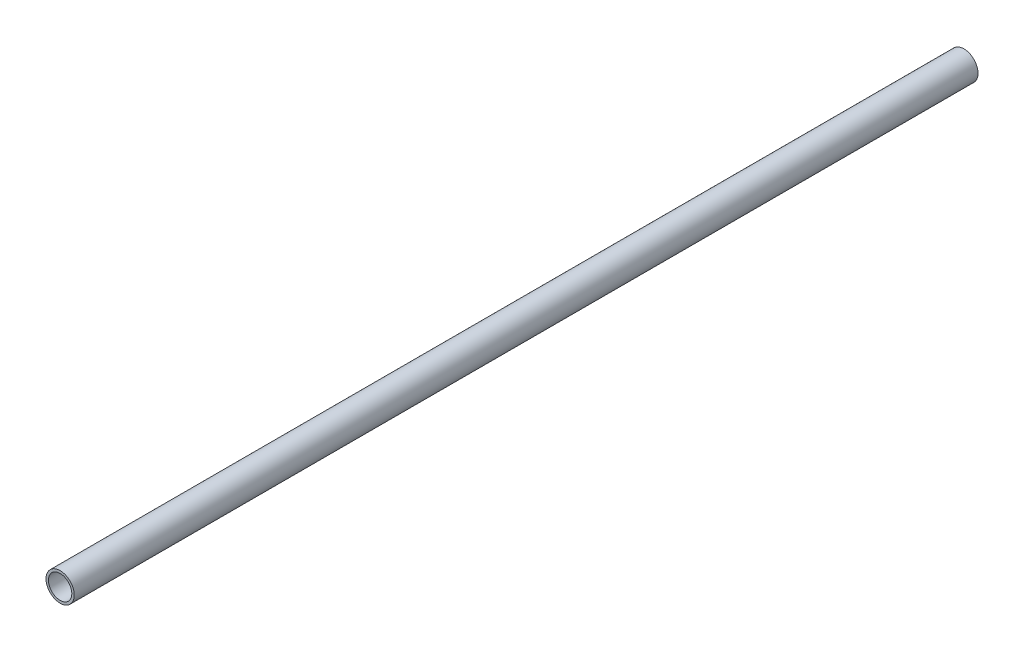
ISO-10303-21;
HEADER;
FILE_DESCRIPTION(('STEP AP214'),'2;1');
FILE_NAME('part.step','',(''),(''),'','','');
FILE_SCHEMA(('AUTOMOTIVE_DESIGN { 1 0 10303 214 1 1 1 1 }'));
ENDSEC;
DATA;
#1=APPLICATION_CONTEXT('core data for automotive mechanical design processes');
#2=APPLICATION_PROTOCOL_DEFINITION('international standard','automotive_design',2000,#1);
#3=PRODUCT_CONTEXT('',#1,'mechanical');
#4=PRODUCT('Part','Part','',(#3));
#5=PRODUCT_RELATED_PRODUCT_CATEGORY('part','',(#4));
#6=PRODUCT_DEFINITION_FORMATION('','',#4);
#7=PRODUCT_DEFINITION_CONTEXT('part definition',#1,'design');
#8=PRODUCT_DEFINITION('design','',#6,#7);
#9=PRODUCT_DEFINITION_SHAPE('','',#8);
#10=(LENGTH_UNIT() NAMED_UNIT(*) SI_UNIT(.MILLI.,.METRE.));
#11=(NAMED_UNIT(*) PLANE_ANGLE_UNIT() SI_UNIT($,.RADIAN.));
#12=(NAMED_UNIT(*) SI_UNIT($,.STERADIAN.) SOLID_ANGLE_UNIT());
#13=UNCERTAINTY_MEASURE_WITH_UNIT(LENGTH_MEASURE(1.E-05),#10,'distance_accuracy_value','');
#14=(GEOMETRIC_REPRESENTATION_CONTEXT(3) GLOBAL_UNCERTAINTY_ASSIGNED_CONTEXT((#13)) GLOBAL_UNIT_ASSIGNED_CONTEXT((#10,
#11,#12)) REPRESENTATION_CONTEXT('',''));
#15=CARTESIAN_POINT('',(0.,0.,0.));
#16=DIRECTION('',(0.,0.,1.));
#17=DIRECTION('',(1.,0.,0.));
#18=AXIS2_PLACEMENT_3D('',#15,#16,#17);
#19=CARTESIAN_POINT('',(0.,0.,304.8));
#20=DIRECTION('',(0.,0.,1.));
#21=DIRECTION('',(1.,0.,0.));
#22=AXIS2_PLACEMENT_3D('',#19,#20,#21);
#23=PLANE('',#22);
#24=CARTESIAN_POINT('',(0.,0.,304.8));
#25=DIRECTION('',(0.,0.,1.));
#26=DIRECTION('',(1.,0.,0.));
#27=AXIS2_PLACEMENT_3D('',#24,#25,#26);
#28=CIRCLE('',#27,9.525);
#29=CARTESIAN_POINT('',(-9.525,0.,304.8));
#30=VERTEX_POINT('',#29);
#31=EDGE_CURVE('E10',#30,#30,#28,.T.);
#32=ORIENTED_EDGE('',*,*,#31,.T.);
#33=EDGE_LOOP('',(#32));
#34=FACE_BOUND('',#33,.T.);
#35=CARTESIAN_POINT('',(0.,0.,304.8));
#36=DIRECTION('',(0.,0.,1.));
#37=DIRECTION('',(1.,0.,0.));
#38=AXIS2_PLACEMENT_3D('',#35,#36,#37);
#39=CIRCLE('',#38,7.874);
#40=CARTESIAN_POINT('',(-7.874,0.,304.8));
#41=VERTEX_POINT('',#40);
#42=EDGE_CURVE('E41',#41,#41,#39,.T.);
#43=ORIENTED_EDGE('',*,*,#42,.F.);
#44=EDGE_LOOP('',(#43));
#45=FACE_BOUND('',#44,.T.);
#46=ADVANCED_FACE('F30',(#34,#45),#23,.T.);
#47=CARTESIAN_POINT('',(0.,0.,-304.8));
#48=DIRECTION('',(0.,0.,1.));
#49=DIRECTION('',(1.,0.,0.));
#50=AXIS2_PLACEMENT_3D('',#47,#48,#49);
#51=PLANE('',#50);
#52=CARTESIAN_POINT('',(0.,0.,-304.8));
#53=DIRECTION('',(0.,0.,1.));
#54=DIRECTION('',(1.,0.,0.));
#55=AXIS2_PLACEMENT_3D('',#52,#53,#54);
#56=CIRCLE('',#55,9.525);
#57=CARTESIAN_POINT('',(-9.525,0.,-304.8));
#58=VERTEX_POINT('',#57);
#59=EDGE_CURVE('E34',#58,#58,#56,.T.);
#60=ORIENTED_EDGE('',*,*,#59,.F.);
#61=EDGE_LOOP('',(#60));
#62=FACE_BOUND('',#61,.T.);
#63=CARTESIAN_POINT('',(0.,0.,-304.8));
#64=DIRECTION('',(0.,0.,1.));
#65=DIRECTION('',(1.,0.,0.));
#66=AXIS2_PLACEMENT_3D('',#63,#64,#65);
#67=CIRCLE('',#66,7.874);
#68=CARTESIAN_POINT('',(-7.874,0.,-304.8));
#69=VERTEX_POINT('',#68);
#70=EDGE_CURVE('E43',#69,#69,#67,.T.);
#71=ORIENTED_EDGE('',*,*,#70,.T.);
#72=EDGE_LOOP('',(#71));
#73=FACE_BOUND('',#72,.T.);
#74=ADVANCED_FACE('F53',(#62,#73),#51,.F.);
#75=CARTESIAN_POINT('',(0.,0.,304.8));
#76=DIRECTION('',(0.,0.,-1.));
#77=DIRECTION('',(-1.,0.,0.));
#78=AXIS2_PLACEMENT_3D('',#75,#76,#77);
#79=CYLINDRICAL_SURFACE('',#78,9.525);
#80=CARTESIAN_POINT('',(-9.525,0.,304.8));
#81=CARTESIAN_POINT('',(-9.525,0.,298.45));
#82=CARTESIAN_POINT('',(-9.525,0.,292.1));
#83=CARTESIAN_POINT('',(-9.525,0.,279.4));
#84=CARTESIAN_POINT('',(-9.525,0.,273.05));
#85=CARTESIAN_POINT('',(-9.525,0.,260.35));
#86=CARTESIAN_POINT('',(-9.525,0.,254.));
#87=CARTESIAN_POINT('',(-9.525,0.,241.3));
#88=CARTESIAN_POINT('',(-9.525,0.,234.95));
#89=CARTESIAN_POINT('',(-9.525,0.,222.25));
#90=CARTESIAN_POINT('',(-9.525,0.,215.9));
#91=CARTESIAN_POINT('',(-9.525,0.,203.2));
#92=CARTESIAN_POINT('',(-9.525,0.,196.85));
#93=CARTESIAN_POINT('',(-9.525,0.,184.15));
#94=CARTESIAN_POINT('',(-9.525,0.,177.8));
#95=CARTESIAN_POINT('',(-9.525,0.,165.1));
#96=CARTESIAN_POINT('',(-9.525,0.,158.75));
#97=CARTESIAN_POINT('',(-9.525,0.,146.05));
#98=CARTESIAN_POINT('',(-9.525,0.,139.7));
#99=CARTESIAN_POINT('',(-9.525,0.,127.));
#100=CARTESIAN_POINT('',(-9.525,0.,120.65));
#101=CARTESIAN_POINT('',(-9.525,0.,107.95));
#102=CARTESIAN_POINT('',(-9.525,0.,101.6));
#103=CARTESIAN_POINT('',(-9.525,0.,88.9));
#104=CARTESIAN_POINT('',(-9.525,0.,82.55));
#105=CARTESIAN_POINT('',(-9.525,0.,69.85));
#106=CARTESIAN_POINT('',(-9.525,0.,63.5));
#107=CARTESIAN_POINT('',(-9.525,0.,50.8));
#108=CARTESIAN_POINT('',(-9.525,0.,44.45));
#109=CARTESIAN_POINT('',(-9.525,0.,31.75));
#110=CARTESIAN_POINT('',(-9.525,0.,25.4));
#111=CARTESIAN_POINT('',(-9.525,0.,12.7));
#112=CARTESIAN_POINT('',(-9.525,0.,6.34999999999995));
#113=CARTESIAN_POINT('',(-9.525,0.,-6.35000000000006));
#114=CARTESIAN_POINT('',(-9.525,0.,-12.7000000000001));
#115=CARTESIAN_POINT('',(-9.525,0.,-25.4000000000001));
#116=CARTESIAN_POINT('',(-9.525,0.,-31.7500000000001));
#117=CARTESIAN_POINT('',(-9.525,0.,-44.4500000000001));
#118=CARTESIAN_POINT('',(-9.525,0.,-50.8000000000001));
#119=CARTESIAN_POINT('',(-9.525,0.,-63.5000000000001));
#120=CARTESIAN_POINT('',(-9.525,0.,-69.8500000000001));
#121=CARTESIAN_POINT('',(-9.525,0.,-82.5500000000001));
#122=CARTESIAN_POINT('',(-9.525,0.,-88.9000000000001));
#123=CARTESIAN_POINT('',(-9.525,0.,-101.6));
#124=CARTESIAN_POINT('',(-9.525,0.,-107.95));
#125=CARTESIAN_POINT('',(-9.525,0.,-120.65));
#126=CARTESIAN_POINT('',(-9.525,0.,-127.));
#127=CARTESIAN_POINT('',(-9.525,0.,-139.7));
#128=CARTESIAN_POINT('',(-9.525,0.,-146.05));
#129=CARTESIAN_POINT('',(-9.525,0.,-158.75));
#130=CARTESIAN_POINT('',(-9.525,0.,-165.1));
#131=CARTESIAN_POINT('',(-9.525,0.,-177.8));
#132=CARTESIAN_POINT('',(-9.525,0.,-184.15));
#133=CARTESIAN_POINT('',(-9.525,0.,-196.85));
#134=CARTESIAN_POINT('',(-9.525,0.,-203.2));
#135=CARTESIAN_POINT('',(-9.525,0.,-215.9));
#136=CARTESIAN_POINT('',(-9.525,0.,-222.25));
#137=CARTESIAN_POINT('',(-9.525,0.,-234.95));
#138=CARTESIAN_POINT('',(-9.525,0.,-241.3));
#139=CARTESIAN_POINT('',(-9.525,0.,-254.));
#140=CARTESIAN_POINT('',(-9.525,0.,-260.35));
#141=CARTESIAN_POINT('',(-9.525,0.,-273.05));
#142=CARTESIAN_POINT('',(-9.525,0.,-279.4));
#143=CARTESIAN_POINT('',(-9.525,0.,-292.1));
#144=CARTESIAN_POINT('',(-9.525,0.,-298.45));
#145=CARTESIAN_POINT('',(-9.525,0.,-304.8));
#146=B_SPLINE_CURVE_WITH_KNOTS('',3,(#80,#81,#82,#83,#84,#85,#86,#87,#88,#89,#90,#91,#92,#93,
#94,#95,#96,#97,#98,#99,#100,#101,#102,#103,#104,#105,#106,#107,#108,#109,#110,#111,#112,#113,
#114,#115,#116,#117,#118,#119,#120,#121,#122,#123,#124,#125,#126,#127,#128,#129,#130,#131,#132,
#133,#134,#135,#136,#137,#138,#139,#140,#141,#142,#143,#144,#145),.UNSPECIFIED.,.F.,.F.,(4,2,2,
2,2,2,2,2,2,2,2,2,2,2,2,2,2,2,2,2,2,2,2,2,2,2,2,2,2,2,2,2,4),(0.,19.05,38.1,57.15,76.2,95.25,
114.3,133.35,152.4,171.45,190.5,209.55,228.6,247.65,266.7,285.75,304.8,323.85,342.9,361.95,381.,
400.05,419.1,438.15,457.2,476.25,495.3,514.35,533.4,552.45,571.5,590.55,609.6),.UNSPECIFIED.);
#147=EDGE_CURVE('BSEAM32',#30,#58,#146,.T.);
#148=ORIENTED_EDGE('',*,*,#31,.F.);
#149=ORIENTED_EDGE('',*,*,#59,.T.);
#150=ORIENTED_EDGE('',*,*,#147,.T.);
#151=ORIENTED_EDGE('',*,*,#147,.F.);
#152=EDGE_LOOP('',(#148,#150,#149,#151));
#153=FACE_BOUND('',#152,.T.);
#154=ADVANCED_FACE('F32',(#153),#79,.T.);
#155=CARTESIAN_POINT('',(0.,0.,304.8));
#156=DIRECTION('',(0.,0.,-1.));
#157=DIRECTION('',(-1.,0.,0.));
#158=AXIS2_PLACEMENT_3D('',#155,#156,#157);
#159=CYLINDRICAL_SURFACE('',#158,7.874);
#160=CARTESIAN_POINT('',(-7.874,0.,304.8));
#161=CARTESIAN_POINT('',(-7.874,0.,298.45));
#162=CARTESIAN_POINT('',(-7.874,0.,292.1));
#163=CARTESIAN_POINT('',(-7.874,0.,279.4));
#164=CARTESIAN_POINT('',(-7.874,0.,273.05));
#165=CARTESIAN_POINT('',(-7.874,0.,260.35));
#166=CARTESIAN_POINT('',(-7.874,0.,254.));
#167=CARTESIAN_POINT('',(-7.874,0.,241.3));
#168=CARTESIAN_POINT('',(-7.874,0.,234.95));
#169=CARTESIAN_POINT('',(-7.874,0.,222.25));
#170=CARTESIAN_POINT('',(-7.874,0.,215.9));
#171=CARTESIAN_POINT('',(-7.874,0.,203.2));
#172=CARTESIAN_POINT('',(-7.874,0.,196.85));
#173=CARTESIAN_POINT('',(-7.874,0.,184.15));
#174=CARTESIAN_POINT('',(-7.874,0.,177.8));
#175=CARTESIAN_POINT('',(-7.874,0.,165.1));
#176=CARTESIAN_POINT('',(-7.874,0.,158.75));
#177=CARTESIAN_POINT('',(-7.874,0.,146.05));
#178=CARTESIAN_POINT('',(-7.874,0.,139.7));
#179=CARTESIAN_POINT('',(-7.874,0.,127.));
#180=CARTESIAN_POINT('',(-7.874,0.,120.65));
#181=CARTESIAN_POINT('',(-7.874,0.,107.95));
#182=CARTESIAN_POINT('',(-7.874,0.,101.6));
#183=CARTESIAN_POINT('',(-7.874,0.,88.9));
#184=CARTESIAN_POINT('',(-7.874,0.,82.55));
#185=CARTESIAN_POINT('',(-7.874,0.,69.85));
#186=CARTESIAN_POINT('',(-7.874,0.,63.5));
#187=CARTESIAN_POINT('',(-7.874,0.,50.8));
#188=CARTESIAN_POINT('',(-7.874,0.,44.45));
#189=CARTESIAN_POINT('',(-7.874,0.,31.75));
#190=CARTESIAN_POINT('',(-7.874,0.,25.4));
#191=CARTESIAN_POINT('',(-7.874,0.,12.7));
#192=CARTESIAN_POINT('',(-7.874,0.,6.35));
#193=CARTESIAN_POINT('',(-7.874,0.,-6.35));
#194=CARTESIAN_POINT('',(-7.874,0.,-12.7));
#195=CARTESIAN_POINT('',(-7.874,0.,-25.4));
#196=CARTESIAN_POINT('',(-7.874,0.,-31.75));
#197=CARTESIAN_POINT('',(-7.874,0.,-44.45));
#198=CARTESIAN_POINT('',(-7.874,0.,-50.8));
#199=CARTESIAN_POINT('',(-7.874,0.,-63.5));
#200=CARTESIAN_POINT('',(-7.874,0.,-69.85));
#201=CARTESIAN_POINT('',(-7.874,0.,-82.55));
#202=CARTESIAN_POINT('',(-7.874,0.,-88.9));
#203=CARTESIAN_POINT('',(-7.874,0.,-101.6));
#204=CARTESIAN_POINT('',(-7.874,0.,-107.95));
#205=CARTESIAN_POINT('',(-7.874,0.,-120.65));
#206=CARTESIAN_POINT('',(-7.874,0.,-127.));
#207=CARTESIAN_POINT('',(-7.874,0.,-139.7));
#208=CARTESIAN_POINT('',(-7.874,0.,-146.05));
#209=CARTESIAN_POINT('',(-7.874,0.,-158.75));
#210=CARTESIAN_POINT('',(-7.874,0.,-165.1));
#211=CARTESIAN_POINT('',(-7.874,0.,-177.8));
#212=CARTESIAN_POINT('',(-7.874,0.,-184.15));
#213=CARTESIAN_POINT('',(-7.874,0.,-196.85));
#214=CARTESIAN_POINT('',(-7.874,0.,-203.2));
#215=CARTESIAN_POINT('',(-7.874,0.,-215.9));
#216=CARTESIAN_POINT('',(-7.874,0.,-222.25));
#217=CARTESIAN_POINT('',(-7.874,0.,-234.95));
#218=CARTESIAN_POINT('',(-7.874,0.,-241.3));
#219=CARTESIAN_POINT('',(-7.874,0.,-254.));
#220=CARTESIAN_POINT('',(-7.874,0.,-260.35));
#221=CARTESIAN_POINT('',(-7.874,0.,-273.05));
#222=CARTESIAN_POINT('',(-7.874,0.,-279.4));
#223=CARTESIAN_POINT('',(-7.874,0.,-292.1));
#224=CARTESIAN_POINT('',(-7.874,0.,-298.45));
#225=CARTESIAN_POINT('',(-7.874,0.,-304.8));
#226=B_SPLINE_CURVE_WITH_KNOTS('',3,(#160,#161,#162,#163,#164,#165,#166,#167,#168,#169,#170,
#171,#172,#173,#174,#175,#176,#177,#178,#179,#180,#181,#182,#183,#184,#185,#186,#187,#188,#189,
#190,#191,#192,#193,#194,#195,#196,#197,#198,#199,#200,#201,#202,#203,#204,#205,#206,#207,#208,
#209,#210,#211,#212,#213,#214,#215,#216,#217,#218,#219,#220,#221,#222,#223,#224,#225),
.UNSPECIFIED.,.F.,.F.,(4,2,2,2,2,2,2,2,2,2,2,2,2,2,2,2,2,2,2,2,2,2,2,2,2,2,2,2,2,2,2,2,4),(0.,
19.05,38.1,57.15,76.2,95.2500000000001,114.3,133.35,152.4,171.45,190.5,209.55,228.6,247.65,
266.7,285.75,304.8,323.85,342.9,361.95,381.,400.05,419.1,438.15,457.2,476.25,495.3,514.35,533.4,
552.45,571.5,590.55,609.6),.UNSPECIFIED.);
#227=EDGE_CURVE('BSEAM49',#41,#69,#226,.T.);
#228=ORIENTED_EDGE('',*,*,#42,.T.);
#229=ORIENTED_EDGE('',*,*,#70,.F.);
#230=ORIENTED_EDGE('',*,*,#227,.T.);
#231=ORIENTED_EDGE('',*,*,#227,.F.);
#232=EDGE_LOOP('',(#228,#230,#229,#231));
#233=FACE_BOUND('',#232,.T.);
#234=ADVANCED_FACE('F49',(#233),#159,.F.);
#235=CLOSED_SHELL('',(#46,#74,#154,#234));
#236=MANIFOLD_SOLID_BREP('B2',#235);
#237=ADVANCED_BREP_SHAPE_REPRESENTATION('',(#18,#236),#14);
#238=SHAPE_DEFINITION_REPRESENTATION(#9,#237);
ENDSEC;
END-ISO-10303-21;
